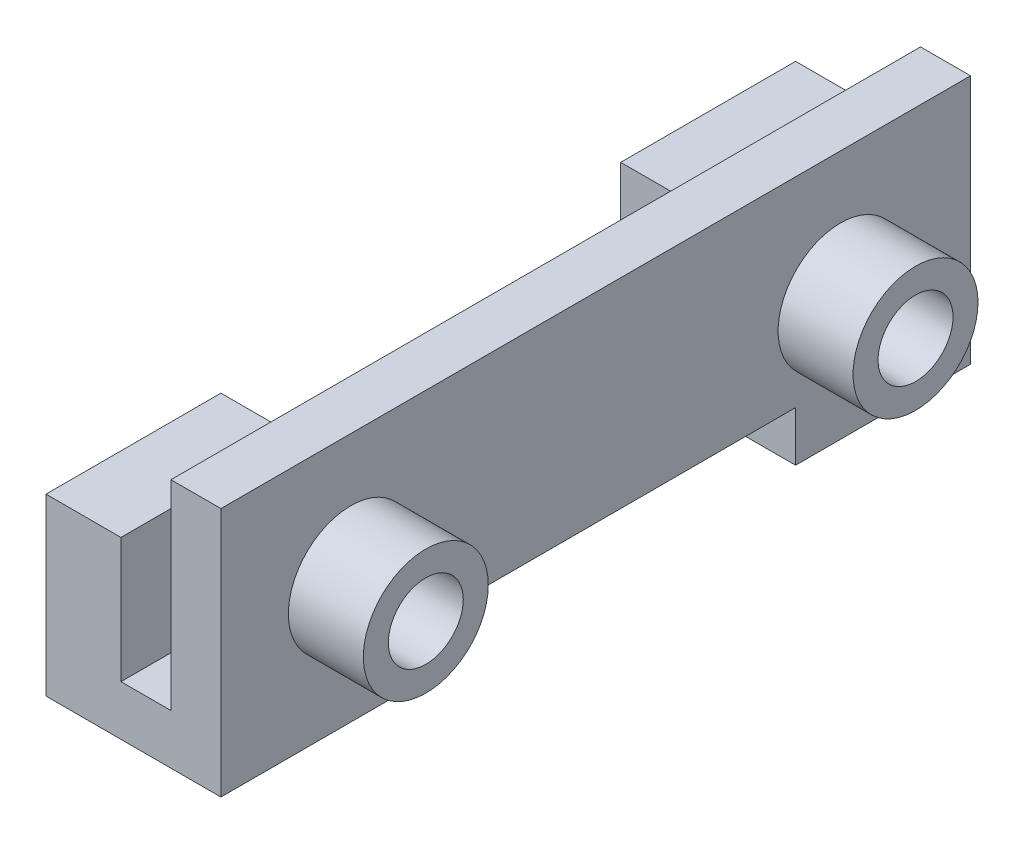
ISO-10303-21;
HEADER;
FILE_DESCRIPTION(('STEP AP214'),'2;1');
FILE_NAME('part.step','',(''),(''),'','','');
FILE_SCHEMA(('AUTOMOTIVE_DESIGN { 1 0 10303 214 1 1 1 1 }'));
ENDSEC;
DATA;
#1=APPLICATION_CONTEXT('core data for automotive mechanical design processes');
#2=APPLICATION_PROTOCOL_DEFINITION('international standard','automotive_design',2000,#1);
#3=PRODUCT_CONTEXT('',#1,'mechanical');
#4=PRODUCT('Part','Part','',(#3));
#5=PRODUCT_RELATED_PRODUCT_CATEGORY('part','',(#4));
#6=PRODUCT_DEFINITION_FORMATION('','',#4);
#7=PRODUCT_DEFINITION_CONTEXT('part definition',#1,'design');
#8=PRODUCT_DEFINITION('design','',#6,#7);
#9=PRODUCT_DEFINITION_SHAPE('','',#8);
#10=(LENGTH_UNIT() NAMED_UNIT(*) SI_UNIT(.MILLI.,.METRE.));
#11=(NAMED_UNIT(*) PLANE_ANGLE_UNIT() SI_UNIT($,.RADIAN.));
#12=(NAMED_UNIT(*) SI_UNIT($,.STERADIAN.) SOLID_ANGLE_UNIT());
#13=UNCERTAINTY_MEASURE_WITH_UNIT(LENGTH_MEASURE(1.E-05),#10,'distance_accuracy_value','');
#14=(GEOMETRIC_REPRESENTATION_CONTEXT(3) GLOBAL_UNCERTAINTY_ASSIGNED_CONTEXT((#13)) GLOBAL_UNIT_ASSIGNED_CONTEXT((#10,
#11,#12)) REPRESENTATION_CONTEXT('',''));
#15=CARTESIAN_POINT('',(0.,0.,0.));
#16=DIRECTION('',(0.,0.,1.));
#17=DIRECTION('',(1.,0.,0.));
#18=AXIS2_PLACEMENT_3D('',#15,#16,#17);
#19=CARTESIAN_POINT('',(-5.,-3.,-15.));
#20=DIRECTION('',(0.,-1.,0.));
#21=DIRECTION('',(0.,0.,-1.));
#22=AXIS2_PLACEMENT_3D('',#19,#20,#21);
#23=PLANE('',#22);
#24=DIRECTION('',(0.,0.,-1.));
#25=VECTOR('',#24,1.);
#26=CARTESIAN_POINT('',(-2.,-3.,-15.));
#27=LINE('',#26,#25);
#28=CARTESIAN_POINT('',(-2.,-3.,-8.));
#29=VERTEX_POINT('',#28);
#30=CARTESIAN_POINT('',(-2.,-3.,-15.));
#31=VERTEX_POINT('',#30);
#32=EDGE_CURVE('E183',#29,#31,#27,.T.);
#33=ORIENTED_EDGE('',*,*,#32,.F.);
#34=DIRECTION('',(1.,0.,0.));
#35=VECTOR('',#34,1.);
#36=CARTESIAN_POINT('',(-5.,-3.,-8.));
#37=LINE('',#36,#35);
#38=CARTESIAN_POINT('',(0.,-3.,-8.));
#39=VERTEX_POINT('',#38);
#40=EDGE_CURVE('E213',#29,#39,#37,.T.);
#41=ORIENTED_EDGE('',*,*,#40,.T.);
#42=DIRECTION('',(0.,0.,-1.));
#43=VECTOR('',#42,1.);
#44=CARTESIAN_POINT('',(0.,-3.,-15.));
#45=LINE('',#44,#43);
#46=CARTESIAN_POINT('',(0.,-3.,-15.));
#47=VERTEX_POINT('',#46);
#48=EDGE_CURVE('E200',#39,#47,#45,.T.);
#49=ORIENTED_EDGE('',*,*,#48,.T.);
#50=DIRECTION('',(1.,0.,0.));
#51=VECTOR('',#50,1.);
#52=CARTESIAN_POINT('',(-5.,-3.,-15.));
#53=LINE('',#52,#51);
#54=EDGE_CURVE('E209',#31,#47,#53,.T.);
#55=ORIENTED_EDGE('',*,*,#54,.F.);
#56=EDGE_LOOP('',(#33,#41,#49,#55));
#57=FACE_BOUND('',#56,.T.);
#58=ADVANCED_FACE('F33',(#57),#23,.F.);
#59=CARTESIAN_POINT('',(0.,0.,0.));
#60=DIRECTION('',(1.,0.,0.));
#61=DIRECTION('',(0.,0.,-1.));
#62=AXIS2_PLACEMENT_3D('',#59,#60,#61);
#63=PLANE('',#62);
#64=CARTESIAN_POINT('',(0.,0.,-9.8));
#65=DIRECTION('',(1.,0.,0.));
#66=DIRECTION('',(0.,0.,-1.));
#67=AXIS2_PLACEMENT_3D('',#64,#65,#66);
#68=CIRCLE('',#67,1.5);
#69=CARTESIAN_POINT('',(0.,0.,-11.3));
#70=VERTEX_POINT('',#69);
#71=EDGE_CURVE('E237',#70,#70,#68,.T.);
#72=ORIENTED_EDGE('',*,*,#71,.T.);
#73=EDGE_LOOP('',(#72));
#74=FACE_BOUND('',#73,.T.);
#75=CARTESIAN_POINT('',(0.,0.,9.8));
#76=DIRECTION('',(1.,0.,0.));
#77=DIRECTION('',(0.,0.,-1.));
#78=AXIS2_PLACEMENT_3D('',#75,#76,#77);
#79=CIRCLE('',#78,1.5);
#80=CARTESIAN_POINT('',(0.,0.,8.3));
#81=VERTEX_POINT('',#80);
#82=EDGE_CURVE('E243',#81,#81,#79,.T.);
#83=ORIENTED_EDGE('',*,*,#82,.T.);
#84=EDGE_LOOP('',(#83));
#85=FACE_BOUND('',#84,.T.);
#86=DIRECTION('',(0.,0.,-1.));
#87=VECTOR('',#86,1.);
#88=CARTESIAN_POINT('',(0.,-3.,8.));
#89=LINE('',#88,#87);
#90=CARTESIAN_POINT('',(0.,-3.,8.));
#91=VERTEX_POINT('',#90);
#92=EDGE_CURVE('E230',#91,#39,#89,.T.);
#93=ORIENTED_EDGE('',*,*,#92,.F.);
#94=DIRECTION('',(0.,0.,1.));
#95=VECTOR('',#94,1.);
#96=CARTESIAN_POINT('',(0.,-3.,15.));
#97=LINE('',#96,#95);
#98=CARTESIAN_POINT('',(0.,-3.,15.));
#99=VERTEX_POINT('',#98);
#100=EDGE_CURVE('E152',#91,#99,#97,.T.);
#101=ORIENTED_EDGE('',*,*,#100,.T.);
#102=DIRECTION('',(0.,-1.,0.));
#103=VECTOR('',#102,1.);
#104=CARTESIAN_POINT('',(0.,5.,15.));
#105=LINE('',#104,#103);
#106=CARTESIAN_POINT('',(0.,5.,15.));
#107=VERTEX_POINT('',#106);
#108=EDGE_CURVE('E265',#107,#99,#105,.T.);
#109=ORIENTED_EDGE('',*,*,#108,.F.);
#110=DIRECTION('',(0.,0.,1.));
#111=VECTOR('',#110,1.);
#112=CARTESIAN_POINT('',(0.,5.,15.));
#113=LINE('',#112,#111);
#114=CARTESIAN_POINT('',(0.,5.,-15.));
#115=VERTEX_POINT('',#114);
#116=EDGE_CURVE('E275',#115,#107,#113,.T.);
#117=ORIENTED_EDGE('',*,*,#116,.F.);
#118=DIRECTION('',(0.,1.,0.));
#119=VECTOR('',#118,1.);
#120=CARTESIAN_POINT('',(0.,5.,-15.));
#121=LINE('',#120,#119);
#122=EDGE_CURVE('E258',#47,#115,#121,.T.);
#123=ORIENTED_EDGE('',*,*,#122,.F.);
#124=ORIENTED_EDGE('',*,*,#48,.F.);
#125=EDGE_LOOP('',(#93,#101,#109,#117,#123,#124));
#126=FACE_BOUND('',#125,.T.);
#127=ADVANCED_FACE('F288',(#74,#85,#126),#63,.F.);
#128=CARTESIAN_POINT('',(2.,-5.,15.));
#129=DIRECTION('',(0.,1.,0.));
#130=DIRECTION('',(0.,0.,1.));
#131=AXIS2_PLACEMENT_3D('',#128,#129,#130);
#132=PLANE('',#131);
#133=DIRECTION('',(-1.,0.,0.));
#134=VECTOR('',#133,1.);
#135=CARTESIAN_POINT('',(0.,-5.,-8.));
#136=LINE('',#135,#134);
#137=CARTESIAN_POINT('',(2.,-5.,-8.));
#138=VERTEX_POINT('',#137);
#139=CARTESIAN_POINT('',(-5.,-5.,-8.));
#140=VERTEX_POINT('',#139);
#141=EDGE_CURVE('E215',#138,#140,#136,.T.);
#142=ORIENTED_EDGE('',*,*,#141,.T.);
#143=DIRECTION('',(0.,0.,1.));
#144=VECTOR('',#143,1.);
#145=CARTESIAN_POINT('',(-5.,-5.,-15.));
#146=LINE('',#145,#144);
#147=CARTESIAN_POINT('',(-5.,-5.,-15.));
#148=VERTEX_POINT('',#147);
#149=EDGE_CURVE('E204',#148,#140,#146,.T.);
#150=ORIENTED_EDGE('',*,*,#149,.F.);
#151=DIRECTION('',(-1.,0.,0.));
#152=VECTOR('',#151,1.);
#153=CARTESIAN_POINT('',(2.,-5.,-15.));
#154=LINE('',#153,#152);
#155=CARTESIAN_POINT('',(2.,-5.,-15.));
#156=VERTEX_POINT('',#155);
#157=EDGE_CURVE('E273',#156,#148,#154,.T.);
#158=ORIENTED_EDGE('',*,*,#157,.F.);
#159=DIRECTION('',(0.,0.,-1.));
#160=VECTOR('',#159,1.);
#161=CARTESIAN_POINT('',(2.,-5.,15.));
#162=LINE('',#161,#160);
#163=EDGE_CURVE('E269',#138,#156,#162,.T.);
#164=ORIENTED_EDGE('',*,*,#163,.F.);
#165=EDGE_LOOP('',(#142,#150,#158,#164));
#166=FACE_BOUND('',#165,.T.);
#167=ADVANCED_FACE('F323',(#166),#132,.F.);
#168=CARTESIAN_POINT('',(2.,0.,0.));
#169=DIRECTION('',(1.,0.,0.));
#170=DIRECTION('',(0.,0.,-1.));
#171=AXIS2_PLACEMENT_3D('',#168,#169,#170);
#172=PLANE('',#171);
#173=CARTESIAN_POINT('',(2.,0.,9.8));
#174=DIRECTION('',(1.,0.,0.));
#175=DIRECTION('',(0.,0.,-1.));
#176=AXIS2_PLACEMENT_3D('',#173,#174,#175);
#177=CIRCLE('',#176,2.5);
#178=CARTESIAN_POINT('',(2.,0.,7.3));
#179=VERTEX_POINT('',#178);
#180=EDGE_CURVE('E249',#179,#179,#177,.T.);
#181=ORIENTED_EDGE('',*,*,#180,.F.);
#182=EDGE_LOOP('',(#181));
#183=FACE_BOUND('',#182,.T.);
#184=CARTESIAN_POINT('',(2.,0.,-9.8));
#185=DIRECTION('',(1.,0.,0.));
#186=DIRECTION('',(0.,0.,-1.));
#187=AXIS2_PLACEMENT_3D('',#184,#185,#186);
#188=CIRCLE('',#187,2.5);
#189=CARTESIAN_POINT('',(2.,0.,-12.3));
#190=VERTEX_POINT('',#189);
#191=EDGE_CURVE('E252',#190,#190,#188,.T.);
#192=ORIENTED_EDGE('',*,*,#191,.F.);
#193=EDGE_LOOP('',(#192));
#194=FACE_BOUND('',#193,.T.);
#195=DIRECTION('',(0.,0.,1.));
#196=VECTOR('',#195,1.);
#197=CARTESIAN_POINT('',(2.,-3.,8.));
#198=LINE('',#197,#196);
#199=CARTESIAN_POINT('',(2.,-3.,-8.));
#200=VERTEX_POINT('',#199);
#201=CARTESIAN_POINT('',(2.,-3.,8.));
#202=VERTEX_POINT('',#201);
#203=EDGE_CURVE('E224',#200,#202,#198,.T.);
#204=ORIENTED_EDGE('',*,*,#203,.F.);
#205=DIRECTION('',(0.,-1.,0.));
#206=VECTOR('',#205,1.);
#207=CARTESIAN_POINT('',(2.,-3.,-8.));
#208=LINE('',#207,#206);
#209=EDGE_CURVE('E219',#200,#138,#208,.T.);
#210=ORIENTED_EDGE('',*,*,#209,.T.);
#211=ORIENTED_EDGE('',*,*,#163,.T.);
#212=DIRECTION('',(0.,1.,0.));
#213=VECTOR('',#212,1.);
#214=CARTESIAN_POINT('',(2.,5.,-15.));
#215=LINE('',#214,#213);
#216=CARTESIAN_POINT('',(2.,5.,-15.));
#217=VERTEX_POINT('',#216);
#218=EDGE_CURVE('E261',#156,#217,#215,.T.);
#219=ORIENTED_EDGE('',*,*,#218,.T.);
#220=DIRECTION('',(0.,0.,1.));
#221=VECTOR('',#220,1.);
#222=CARTESIAN_POINT('',(2.,5.,15.));
#223=LINE('',#222,#221);
#224=CARTESIAN_POINT('',(2.,5.,15.));
#225=VERTEX_POINT('',#224);
#226=EDGE_CURVE('E264',#217,#225,#223,.T.);
#227=ORIENTED_EDGE('',*,*,#226,.T.);
#228=DIRECTION('',(0.,-1.,0.));
#229=VECTOR('',#228,1.);
#230=CARTESIAN_POINT('',(2.,5.,15.));
#231=LINE('',#230,#229);
#232=CARTESIAN_POINT('',(2.,-5.,15.));
#233=VERTEX_POINT('',#232);
#234=EDGE_CURVE('E267',#225,#233,#231,.T.);
#235=ORIENTED_EDGE('',*,*,#234,.T.);
#236=CARTESIAN_POINT('',(2.,-5.,8.));
#237=VERTEX_POINT('',#236);
#238=EDGE_CURVE('E270',#233,#237,#162,.T.);
#239=ORIENTED_EDGE('',*,*,#238,.T.);
#240=DIRECTION('',(0.,-1.,0.));
#241=VECTOR('',#240,1.);
#242=CARTESIAN_POINT('',(2.,-3.,8.));
#243=LINE('',#242,#241);
#244=EDGE_CURVE('E233',#202,#237,#243,.T.);
#245=ORIENTED_EDGE('',*,*,#244,.F.);
#246=EDGE_LOOP('',(#204,#210,#211,#219,#227,#235,#239,#245));
#247=FACE_BOUND('',#246,.T.);
#248=ADVANCED_FACE('F302',(#183,#194,#247),#172,.T.);
#249=CARTESIAN_POINT('',(2.,5.,-15.));
#250=DIRECTION('',(0.,0.,1.));
#251=DIRECTION('',(1.,0.,0.));
#252=AXIS2_PLACEMENT_3D('',#249,#250,#251);
#253=PLANE('',#252);
#254=ORIENTED_EDGE('',*,*,#157,.T.);
#255=DIRECTION('',(0.,-1.,0.));
#256=VECTOR('',#255,1.);
#257=CARTESIAN_POINT('',(-5.,-5.,-15.));
#258=LINE('',#257,#256);
#259=CARTESIAN_POINT('',(-5.,2.,-15.));
#260=VERTEX_POINT('',#259);
#261=EDGE_CURVE('E201',#260,#148,#258,.T.);
#262=ORIENTED_EDGE('',*,*,#261,.F.);
#263=DIRECTION('',(-1.,0.,0.));
#264=VECTOR('',#263,1.);
#265=CARTESIAN_POINT('',(-5.,2.,-15.));
#266=LINE('',#265,#264);
#267=CARTESIAN_POINT('',(-2.,2.,-15.));
#268=VERTEX_POINT('',#267);
#269=EDGE_CURVE('E191',#268,#260,#266,.T.);
#270=ORIENTED_EDGE('',*,*,#269,.F.);
#271=DIRECTION('',(0.,-1.,0.));
#272=VECTOR('',#271,1.);
#273=CARTESIAN_POINT('',(-2.,2.,-15.));
#274=LINE('',#273,#272);
#275=EDGE_CURVE('E194',#268,#31,#274,.T.);
#276=ORIENTED_EDGE('',*,*,#275,.T.);
#277=ORIENTED_EDGE('',*,*,#54,.T.);
#278=ORIENTED_EDGE('',*,*,#122,.T.);
#279=DIRECTION('',(-1.,0.,0.));
#280=VECTOR('',#279,1.);
#281=CARTESIAN_POINT('',(2.,5.,-15.));
#282=LINE('',#281,#280);
#283=EDGE_CURVE('E11',#217,#115,#282,.T.);
#284=ORIENTED_EDGE('',*,*,#283,.F.);
#285=ORIENTED_EDGE('',*,*,#218,.F.);
#286=EDGE_LOOP('',(#254,#262,#270,#276,#277,#278,#284,#285));
#287=FACE_BOUND('',#286,.T.);
#288=ADVANCED_FACE('F35',(#287),#253,.F.);
#289=CARTESIAN_POINT('',(2.,5.,15.));
#290=DIRECTION('',(0.,-1.,0.));
#291=DIRECTION('',(0.,0.,-1.));
#292=AXIS2_PLACEMENT_3D('',#289,#290,#291);
#293=PLANE('',#292);
#294=ORIENTED_EDGE('',*,*,#116,.T.);
#295=DIRECTION('',(-1.,0.,0.));
#296=VECTOR('',#295,1.);
#297=CARTESIAN_POINT('',(2.,5.,15.));
#298=LINE('',#297,#296);
#299=EDGE_CURVE('E41',#225,#107,#298,.T.);
#300=ORIENTED_EDGE('',*,*,#299,.F.);
#301=ORIENTED_EDGE('',*,*,#226,.F.);
#302=ORIENTED_EDGE('',*,*,#283,.T.);
#303=EDGE_LOOP('',(#294,#300,#301,#302));
#304=FACE_BOUND('',#303,.T.);
#305=ADVANCED_FACE('F305',(#304),#293,.F.);
#306=CARTESIAN_POINT('',(2.,5.,15.));
#307=DIRECTION('',(0.,0.,-1.));
#308=DIRECTION('',(-1.,0.,0.));
#309=AXIS2_PLACEMENT_3D('',#306,#307,#308);
#310=PLANE('',#309);
#311=ORIENTED_EDGE('',*,*,#108,.T.);
#312=DIRECTION('',(1.,0.,0.));
#313=VECTOR('',#312,1.);
#314=CARTESIAN_POINT('',(-5.,-3.,15.));
#315=LINE('',#314,#313);
#316=CARTESIAN_POINT('',(-2.,-3.,15.));
#317=VERTEX_POINT('',#316);
#318=EDGE_CURVE('E181',#317,#99,#315,.T.);
#319=ORIENTED_EDGE('',*,*,#318,.F.);
#320=DIRECTION('',(0.,-1.,0.));
#321=VECTOR('',#320,1.);
#322=CARTESIAN_POINT('',(-2.,2.,15.));
#323=LINE('',#322,#321);
#324=CARTESIAN_POINT('',(-2.,2.,15.));
#325=VERTEX_POINT('',#324);
#326=EDGE_CURVE('E166',#325,#317,#323,.T.);
#327=ORIENTED_EDGE('',*,*,#326,.F.);
#328=DIRECTION('',(-1.,0.,0.));
#329=VECTOR('',#328,1.);
#330=CARTESIAN_POINT('',(-5.,2.,15.));
#331=LINE('',#330,#329);
#332=CARTESIAN_POINT('',(-5.,2.,15.));
#333=VERTEX_POINT('',#332);
#334=EDGE_CURVE('E158',#325,#333,#331,.T.);
#335=ORIENTED_EDGE('',*,*,#334,.T.);
#336=DIRECTION('',(0.,-1.,0.));
#337=VECTOR('',#336,1.);
#338=CARTESIAN_POINT('',(-5.,-5.,15.));
#339=LINE('',#338,#337);
#340=CARTESIAN_POINT('',(-5.,-5.,15.));
#341=VERTEX_POINT('',#340);
#342=EDGE_CURVE('E140',#333,#341,#339,.T.);
#343=ORIENTED_EDGE('',*,*,#342,.T.);
#344=DIRECTION('',(-1.,0.,0.));
#345=VECTOR('',#344,1.);
#346=CARTESIAN_POINT('',(2.,-5.,15.));
#347=LINE('',#346,#345);
#348=EDGE_CURVE('E279',#233,#341,#347,.T.);
#349=ORIENTED_EDGE('',*,*,#348,.F.);
#350=ORIENTED_EDGE('',*,*,#234,.F.);
#351=ORIENTED_EDGE('',*,*,#299,.T.);
#352=EDGE_LOOP('',(#311,#319,#327,#335,#343,#349,#350,#351));
#353=FACE_BOUND('',#352,.T.);
#354=ADVANCED_FACE('F164',(#353),#310,.F.);
#355=ORIENTED_EDGE('',*,*,#348,.T.);
#356=DIRECTION('',(0.,0.,-1.));
#357=VECTOR('',#356,1.);
#358=CARTESIAN_POINT('',(-5.,-5.,15.));
#359=LINE('',#358,#357);
#360=CARTESIAN_POINT('',(-5.,-5.,8.));
#361=VERTEX_POINT('',#360);
#362=EDGE_CURVE('E147',#341,#361,#359,.T.);
#363=ORIENTED_EDGE('',*,*,#362,.T.);
#364=DIRECTION('',(-1.,0.,0.));
#365=VECTOR('',#364,1.);
#366=CARTESIAN_POINT('',(0.,-5.,8.));
#367=LINE('',#366,#365);
#368=EDGE_CURVE('E223',#237,#361,#367,.T.);
#369=ORIENTED_EDGE('',*,*,#368,.F.);
#370=ORIENTED_EDGE('',*,*,#238,.F.);
#371=EDGE_LOOP('',(#355,#363,#369,#370));
#372=FACE_BOUND('',#371,.T.);
#373=ADVANCED_FACE('F298',(#372),#132,.F.);
#374=CARTESIAN_POINT('',(5.,0.,-9.8));
#375=DIRECTION('',(-1.,0.,0.));
#376=DIRECTION('',(0.,0.,1.));
#377=AXIS2_PLACEMENT_3D('',#374,#375,#376);
#378=CYLINDRICAL_SURFACE('',#377,2.5);
#379=CARTESIAN_POINT('',(5.,0.,-9.8));
#380=DIRECTION('',(1.,0.,0.));
#381=DIRECTION('',(0.,0.,-1.));
#382=AXIS2_PLACEMENT_3D('',#379,#380,#381);
#383=CIRCLE('',#382,2.5);
#384=CARTESIAN_POINT('',(5.,0.,-12.3));
#385=VERTEX_POINT('',#384);
#386=EDGE_CURVE('E255',#385,#385,#383,.T.);
#387=ORIENTED_EDGE('',*,*,#386,.F.);
#388=EDGE_LOOP('',(#387));
#389=FACE_BOUND('',#388,.T.);
#390=ORIENTED_EDGE('',*,*,#191,.T.);
#391=EDGE_LOOP('',(#390));
#392=FACE_BOUND('',#391,.T.);
#393=ADVANCED_FACE('F374',(#389,#392),#378,.T.);
#394=CARTESIAN_POINT('',(5.,0.,-9.8));
#395=DIRECTION('',(1.,0.,0.));
#396=DIRECTION('',(0.,0.,-1.));
#397=AXIS2_PLACEMENT_3D('',#394,#395,#396);
#398=PLANE('',#397);
#399=CARTESIAN_POINT('',(5.,0.,-9.8));
#400=DIRECTION('',(1.,0.,0.));
#401=DIRECTION('',(0.,0.,-1.));
#402=AXIS2_PLACEMENT_3D('',#399,#400,#401);
#403=CIRCLE('',#402,1.5);
#404=CARTESIAN_POINT('',(5.,0.,-11.3));
#405=VERTEX_POINT('',#404);
#406=EDGE_CURVE('E236',#405,#405,#403,.T.);
#407=ORIENTED_EDGE('',*,*,#406,.F.);
#408=EDGE_LOOP('',(#407));
#409=FACE_BOUND('',#408,.T.);
#410=ORIENTED_EDGE('',*,*,#386,.T.);
#411=EDGE_LOOP('',(#410));
#412=FACE_BOUND('',#411,.T.);
#413=ADVANCED_FACE('F367',(#409,#412),#398,.T.);
#414=CARTESIAN_POINT('',(5.,0.,9.8));
#415=DIRECTION('',(-1.,0.,0.));
#416=DIRECTION('',(0.,0.,1.));
#417=AXIS2_PLACEMENT_3D('',#414,#415,#416);
#418=CYLINDRICAL_SURFACE('',#417,2.5);
#419=CARTESIAN_POINT('',(5.,0.,9.8));
#420=DIRECTION('',(1.,0.,0.));
#421=DIRECTION('',(0.,0.,-1.));
#422=AXIS2_PLACEMENT_3D('',#419,#420,#421);
#423=CIRCLE('',#422,2.5);
#424=CARTESIAN_POINT('',(5.,0.,7.3));
#425=VERTEX_POINT('',#424);
#426=EDGE_CURVE('E246',#425,#425,#423,.T.);
#427=ORIENTED_EDGE('',*,*,#426,.F.);
#428=EDGE_LOOP('',(#427));
#429=FACE_BOUND('',#428,.T.);
#430=ORIENTED_EDGE('',*,*,#180,.T.);
#431=EDGE_LOOP('',(#430));
#432=FACE_BOUND('',#431,.T.);
#433=ADVANCED_FACE('F364',(#429,#432),#418,.T.);
#434=CARTESIAN_POINT('',(5.,0.,9.8));
#435=DIRECTION('',(1.,0.,0.));
#436=DIRECTION('',(0.,0.,-1.));
#437=AXIS2_PLACEMENT_3D('',#434,#435,#436);
#438=PLANE('',#437);
#439=CARTESIAN_POINT('',(5.,0.,9.8));
#440=DIRECTION('',(1.,0.,0.));
#441=DIRECTION('',(0.,0.,-1.));
#442=AXIS2_PLACEMENT_3D('',#439,#440,#441);
#443=CIRCLE('',#442,1.5);
#444=CARTESIAN_POINT('',(5.,0.,8.3));
#445=VERTEX_POINT('',#444);
#446=EDGE_CURVE('E240',#445,#445,#443,.T.);
#447=ORIENTED_EDGE('',*,*,#446,.F.);
#448=EDGE_LOOP('',(#447));
#449=FACE_BOUND('',#448,.T.);
#450=ORIENTED_EDGE('',*,*,#426,.T.);
#451=EDGE_LOOP('',(#450));
#452=FACE_BOUND('',#451,.T.);
#453=ADVANCED_FACE('F362',(#449,#452),#438,.T.);
#454=CARTESIAN_POINT('',(0.,0.,9.8));
#455=DIRECTION('',(1.,0.,0.));
#456=DIRECTION('',(0.,0.,-1.));
#457=AXIS2_PLACEMENT_3D('',#454,#455,#456);
#458=CYLINDRICAL_SURFACE('',#457,1.5);
#459=ORIENTED_EDGE('',*,*,#82,.F.);
#460=EDGE_LOOP('',(#459));
#461=FACE_BOUND('',#460,.T.);
#462=ORIENTED_EDGE('',*,*,#446,.T.);
#463=EDGE_LOOP('',(#462));
#464=FACE_BOUND('',#463,.T.);
#465=ADVANCED_FACE('F358',(#461,#464),#458,.F.);
#466=CARTESIAN_POINT('',(0.,0.,-9.8));
#467=DIRECTION('',(1.,0.,0.));
#468=DIRECTION('',(0.,0.,-1.));
#469=AXIS2_PLACEMENT_3D('',#466,#467,#468);
#470=CYLINDRICAL_SURFACE('',#469,1.5);
#471=ORIENTED_EDGE('',*,*,#71,.F.);
#472=EDGE_LOOP('',(#471));
#473=FACE_BOUND('',#472,.T.);
#474=ORIENTED_EDGE('',*,*,#406,.T.);
#475=EDGE_LOOP('',(#474));
#476=FACE_BOUND('',#475,.T.);
#477=ADVANCED_FACE('F355',(#473,#476),#470,.F.);
#478=CARTESIAN_POINT('',(0.,-3.,8.));
#479=DIRECTION('',(0.,0.,1.));
#480=DIRECTION('',(1.,0.,0.));
#481=AXIS2_PLACEMENT_3D('',#478,#479,#480);
#482=PLANE('',#481);
#483=ORIENTED_EDGE('',*,*,#368,.T.);
#484=DIRECTION('',(0.,1.,0.));
#485=VECTOR('',#484,1.);
#486=CARTESIAN_POINT('',(-5.,-5.,8.));
#487=LINE('',#486,#485);
#488=CARTESIAN_POINT('',(-5.,2.,8.));
#489=VERTEX_POINT('',#488);
#490=EDGE_CURVE('E151',#361,#489,#487,.T.);
#491=ORIENTED_EDGE('',*,*,#490,.T.);
#492=DIRECTION('',(1.,0.,0.));
#493=VECTOR('',#492,1.);
#494=CARTESIAN_POINT('',(-5.,2.,8.));
#495=LINE('',#494,#493);
#496=CARTESIAN_POINT('',(-2.,2.,8.));
#497=VERTEX_POINT('',#496);
#498=EDGE_CURVE('E161',#489,#497,#495,.T.);
#499=ORIENTED_EDGE('',*,*,#498,.T.);
#500=DIRECTION('',(0.,-1.,0.));
#501=VECTOR('',#500,1.);
#502=CARTESIAN_POINT('',(-2.,2.,8.));
#503=LINE('',#502,#501);
#504=CARTESIAN_POINT('',(-2.,-3.,8.));
#505=VERTEX_POINT('',#504);
#506=EDGE_CURVE('E172',#497,#505,#503,.T.);
#507=ORIENTED_EDGE('',*,*,#506,.T.);
#508=DIRECTION('',(1.,0.,0.));
#509=VECTOR('',#508,1.);
#510=CARTESIAN_POINT('',(-5.,-3.,8.));
#511=LINE('',#510,#509);
#512=EDGE_CURVE('E53',#505,#91,#511,.T.);
#513=ORIENTED_EDGE('',*,*,#512,.T.);
#514=DIRECTION('',(-1.,0.,0.));
#515=VECTOR('',#514,1.);
#516=CARTESIAN_POINT('',(0.,-3.,8.));
#517=LINE('',#516,#515);
#518=EDGE_CURVE('E227',#202,#91,#517,.T.);
#519=ORIENTED_EDGE('',*,*,#518,.F.);
#520=ORIENTED_EDGE('',*,*,#244,.T.);
#521=EDGE_LOOP('',(#483,#491,#499,#507,#513,#519,#520));
#522=FACE_BOUND('',#521,.T.);
#523=ADVANCED_FACE('F295',(#522),#482,.F.);
#524=CARTESIAN_POINT('',(0.,-3.,0.));
#525=DIRECTION('',(0.,1.,0.));
#526=DIRECTION('',(0.,0.,1.));
#527=AXIS2_PLACEMENT_3D('',#524,#525,#526);
#528=PLANE('',#527);
#529=ORIENTED_EDGE('',*,*,#92,.T.);
#530=DIRECTION('',(-1.,0.,0.));
#531=VECTOR('',#530,1.);
#532=CARTESIAN_POINT('',(0.,-3.,-8.));
#533=LINE('',#532,#531);
#534=EDGE_CURVE('E216',#200,#39,#533,.T.);
#535=ORIENTED_EDGE('',*,*,#534,.F.);
#536=ORIENTED_EDGE('',*,*,#203,.T.);
#537=ORIENTED_EDGE('',*,*,#518,.T.);
#538=EDGE_LOOP('',(#529,#535,#536,#537));
#539=FACE_BOUND('',#538,.T.);
#540=ADVANCED_FACE('F319',(#539),#528,.F.);
#541=CARTESIAN_POINT('',(0.,-3.,-8.));
#542=DIRECTION('',(0.,0.,1.));
#543=DIRECTION('',(1.,0.,0.));
#544=AXIS2_PLACEMENT_3D('',#541,#542,#543);
#545=PLANE('',#544);
#546=ORIENTED_EDGE('',*,*,#141,.F.);
#547=ORIENTED_EDGE('',*,*,#209,.F.);
#548=ORIENTED_EDGE('',*,*,#534,.T.);
#549=ORIENTED_EDGE('',*,*,#40,.F.);
#550=DIRECTION('',(0.,-1.,0.));
#551=VECTOR('',#550,1.);
#552=CARTESIAN_POINT('',(-2.,2.,-8.));
#553=LINE('',#552,#551);
#554=CARTESIAN_POINT('',(-2.,2.,-8.));
#555=VERTEX_POINT('',#554);
#556=EDGE_CURVE('E198',#555,#29,#553,.T.);
#557=ORIENTED_EDGE('',*,*,#556,.F.);
#558=DIRECTION('',(1.,0.,0.));
#559=VECTOR('',#558,1.);
#560=CARTESIAN_POINT('',(-5.,2.,-8.));
#561=LINE('',#560,#559);
#562=CARTESIAN_POINT('',(-5.,2.,-8.));
#563=VERTEX_POINT('',#562);
#564=EDGE_CURVE('E187',#563,#555,#561,.T.);
#565=ORIENTED_EDGE('',*,*,#564,.F.);
#566=DIRECTION('',(0.,1.,0.));
#567=VECTOR('',#566,1.);
#568=CARTESIAN_POINT('',(-5.,-5.,-8.));
#569=LINE('',#568,#567);
#570=EDGE_CURVE('E207',#140,#563,#569,.T.);
#571=ORIENTED_EDGE('',*,*,#570,.F.);
#572=EDGE_LOOP('',(#546,#547,#548,#549,#557,#565,#571));
#573=FACE_BOUND('',#572,.T.);
#574=ADVANCED_FACE('F313',(#573),#545,.T.);
#575=CARTESIAN_POINT('',(-5.,0.,0.));
#576=DIRECTION('',(1.,0.,0.));
#577=DIRECTION('',(0.,0.,-1.));
#578=AXIS2_PLACEMENT_3D('',#575,#576,#577);
#579=PLANE('',#578);
#580=ORIENTED_EDGE('',*,*,#261,.T.);
#581=ORIENTED_EDGE('',*,*,#149,.T.);
#582=ORIENTED_EDGE('',*,*,#570,.T.);
#583=DIRECTION('',(0.,0.,1.));
#584=VECTOR('',#583,1.);
#585=CARTESIAN_POINT('',(-5.,2.,-15.));
#586=LINE('',#585,#584);
#587=EDGE_CURVE('E184',#260,#563,#586,.T.);
#588=ORIENTED_EDGE('',*,*,#587,.F.);
#589=EDGE_LOOP('',(#580,#581,#582,#588));
#590=FACE_BOUND('',#589,.T.);
#591=ADVANCED_FACE('F331',(#590),#579,.F.);
#592=CARTESIAN_POINT('',(-2.,2.,-15.));
#593=DIRECTION('',(-1.,0.,0.));
#594=DIRECTION('',(0.,0.,1.));
#595=AXIS2_PLACEMENT_3D('',#592,#593,#594);
#596=PLANE('',#595);
#597=ORIENTED_EDGE('',*,*,#32,.T.);
#598=ORIENTED_EDGE('',*,*,#275,.F.);
#599=DIRECTION('',(0.,0.,-1.));
#600=VECTOR('',#599,1.);
#601=CARTESIAN_POINT('',(-2.,2.,-15.));
#602=LINE('',#601,#600);
#603=EDGE_CURVE('E189',#555,#268,#602,.T.);
#604=ORIENTED_EDGE('',*,*,#603,.F.);
#605=ORIENTED_EDGE('',*,*,#556,.T.);
#606=EDGE_LOOP('',(#597,#598,#604,#605));
#607=FACE_BOUND('',#606,.T.);
#608=ADVANCED_FACE('F334',(#607),#596,.F.);
#609=CARTESIAN_POINT('',(0.,2.,0.));
#610=DIRECTION('',(0.,1.,0.));
#611=DIRECTION('',(0.,0.,1.));
#612=AXIS2_PLACEMENT_3D('',#609,#610,#611);
#613=PLANE('',#612);
#614=ORIENTED_EDGE('',*,*,#587,.T.);
#615=ORIENTED_EDGE('',*,*,#564,.T.);
#616=ORIENTED_EDGE('',*,*,#603,.T.);
#617=ORIENTED_EDGE('',*,*,#269,.T.);
#618=EDGE_LOOP('',(#614,#615,#616,#617));
#619=FACE_BOUND('',#618,.T.);
#620=ADVANCED_FACE('F329',(#619),#613,.T.);
#621=CARTESIAN_POINT('',(-5.,-3.,15.));
#622=DIRECTION('',(0.,1.,0.));
#623=DIRECTION('',(0.,0.,1.));
#624=AXIS2_PLACEMENT_3D('',#621,#622,#623);
#625=PLANE('',#624);
#626=DIRECTION('',(0.,0.,1.));
#627=VECTOR('',#626,1.);
#628=CARTESIAN_POINT('',(-2.,-3.,15.));
#629=LINE('',#628,#627);
#630=EDGE_CURVE('E48',#505,#317,#629,.T.);
#631=ORIENTED_EDGE('',*,*,#630,.T.);
#632=ORIENTED_EDGE('',*,*,#318,.T.);
#633=ORIENTED_EDGE('',*,*,#100,.F.);
#634=ORIENTED_EDGE('',*,*,#512,.F.);
#635=EDGE_LOOP('',(#631,#632,#633,#634));
#636=FACE_BOUND('',#635,.T.);
#637=ADVANCED_FACE('F291',(#636),#625,.T.);
#638=CARTESIAN_POINT('',(-5.,0.,0.));
#639=DIRECTION('',(1.,0.,0.));
#640=DIRECTION('',(0.,0.,1.));
#641=AXIS2_PLACEMENT_3D('',#638,#639,#640);
#642=PLANE('',#641);
#643=ORIENTED_EDGE('',*,*,#342,.F.);
#644=DIRECTION('',(0.,0.,-1.));
#645=VECTOR('',#644,1.);
#646=CARTESIAN_POINT('',(-5.,2.,15.));
#647=LINE('',#646,#645);
#648=EDGE_CURVE('E144',#333,#489,#647,.T.);
#649=ORIENTED_EDGE('',*,*,#648,.T.);
#650=ORIENTED_EDGE('',*,*,#490,.F.);
#651=ORIENTED_EDGE('',*,*,#362,.F.);
#652=EDGE_LOOP('',(#643,#649,#650,#651));
#653=FACE_BOUND('',#652,.T.);
#654=ADVANCED_FACE('F142',(#653),#642,.F.);
#655=CARTESIAN_POINT('',(-2.,2.,15.));
#656=DIRECTION('',(1.,0.,0.));
#657=DIRECTION('',(0.,0.,-1.));
#658=AXIS2_PLACEMENT_3D('',#655,#656,#657);
#659=PLANE('',#658);
#660=ORIENTED_EDGE('',*,*,#630,.F.);
#661=ORIENTED_EDGE('',*,*,#506,.F.);
#662=DIRECTION('',(0.,0.,1.));
#663=VECTOR('',#662,1.);
#664=CARTESIAN_POINT('',(-2.,2.,15.));
#665=LINE('',#664,#663);
#666=EDGE_CURVE('E167',#497,#325,#665,.T.);
#667=ORIENTED_EDGE('',*,*,#666,.T.);
#668=ORIENTED_EDGE('',*,*,#326,.T.);
#669=EDGE_LOOP('',(#660,#661,#667,#668));
#670=FACE_BOUND('',#669,.T.);
#671=ADVANCED_FACE('F293',(#670),#659,.T.);
#672=CARTESIAN_POINT('',(0.,2.,0.));
#673=DIRECTION('',(0.,1.,0.));
#674=DIRECTION('',(0.,0.,-1.));
#675=AXIS2_PLACEMENT_3D('',#672,#673,#674);
#676=PLANE('',#675);
#677=ORIENTED_EDGE('',*,*,#648,.F.);
#678=ORIENTED_EDGE('',*,*,#334,.F.);
#679=ORIENTED_EDGE('',*,*,#666,.F.);
#680=ORIENTED_EDGE('',*,*,#498,.F.);
#681=EDGE_LOOP('',(#677,#678,#679,#680));
#682=FACE_BOUND('',#681,.T.);
#683=ADVANCED_FACE('F156',(#682),#676,.T.);
#684=CLOSED_SHELL('',(#58,#127,#167,#248,#288,#305,#354,#373,#393,#413,#433,#453,#465,#477,#523,
#540,#574,#591,#608,#620,#637,#654,#671,#683));
#685=MANIFOLD_SOLID_BREP('B2',#684);
#686=ADVANCED_BREP_SHAPE_REPRESENTATION('',(#18,#685),#14);
#687=SHAPE_DEFINITION_REPRESENTATION(#9,#686);
ENDSEC;
END-ISO-10303-21;
